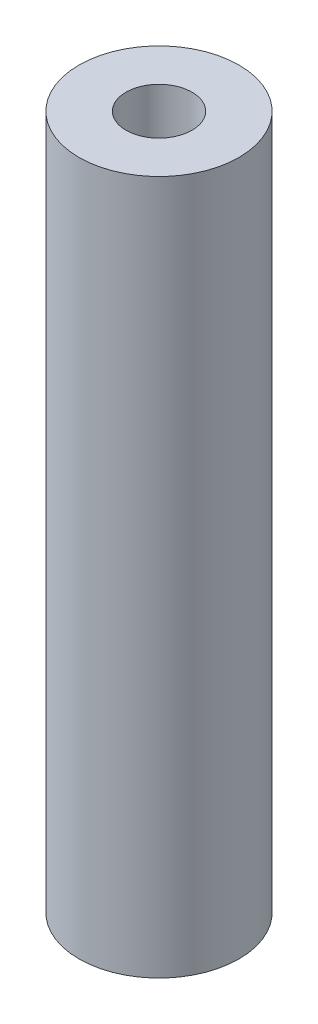
ISO-10303-21;
HEADER;
FILE_DESCRIPTION(('STEP AP214'),'2;1');
FILE_NAME('part.step','',(''),(''),'','','');
FILE_SCHEMA(('AUTOMOTIVE_DESIGN { 1 0 10303 214 1 1 1 1 }'));
ENDSEC;
DATA;
#1=APPLICATION_CONTEXT('core data for automotive mechanical design processes');
#2=APPLICATION_PROTOCOL_DEFINITION('international standard','automotive_design',2000,#1);
#3=PRODUCT_CONTEXT('',#1,'mechanical');
#4=PRODUCT('Part','Part','',(#3));
#5=PRODUCT_RELATED_PRODUCT_CATEGORY('part','',(#4));
#6=PRODUCT_DEFINITION_FORMATION('','',#4);
#7=PRODUCT_DEFINITION_CONTEXT('part definition',#1,'design');
#8=PRODUCT_DEFINITION('design','',#6,#7);
#9=PRODUCT_DEFINITION_SHAPE('','',#8);
#10=(LENGTH_UNIT() NAMED_UNIT(*) SI_UNIT(.MILLI.,.METRE.));
#11=(NAMED_UNIT(*) PLANE_ANGLE_UNIT() SI_UNIT($,.RADIAN.));
#12=(NAMED_UNIT(*) SI_UNIT($,.STERADIAN.) SOLID_ANGLE_UNIT());
#13=UNCERTAINTY_MEASURE_WITH_UNIT(LENGTH_MEASURE(1.E-05),#10,'distance_accuracy_value','');
#14=(GEOMETRIC_REPRESENTATION_CONTEXT(3) GLOBAL_UNCERTAINTY_ASSIGNED_CONTEXT((#13)) GLOBAL_UNIT_ASSIGNED_CONTEXT((#10,
#11,#12)) REPRESENTATION_CONTEXT('',''));
#15=CARTESIAN_POINT('',(0.,0.,0.));
#16=DIRECTION('',(0.,0.,1.));
#17=DIRECTION('',(1.,0.,0.));
#18=AXIS2_PLACEMENT_3D('',#15,#16,#17);
#19=CARTESIAN_POINT('',(0.,34.7,0.));
#20=DIRECTION('',(0.,-1.,0.));
#21=DIRECTION('',(0.,0.,-1.));
#22=AXIS2_PLACEMENT_3D('',#19,#20,#21);
#23=CYLINDRICAL_SURFACE('',#22,4.);
#24=CARTESIAN_POINT('',(0.,34.7,0.));
#25=DIRECTION('',(0.,1.,0.));
#26=DIRECTION('',(0.,0.,1.));
#27=AXIS2_PLACEMENT_3D('',#24,#25,#26);
#28=CIRCLE('',#27,4.);
#29=CARTESIAN_POINT('',(0.,34.7,4.));
#30=VERTEX_POINT('',#29);
#31=EDGE_CURVE('E10',#30,#30,#28,.T.);
#32=ORIENTED_EDGE('',*,*,#31,.F.);
#33=EDGE_LOOP('',(#32));
#34=FACE_BOUND('',#33,.T.);
#35=CARTESIAN_POINT('',(0.,0.,0.));
#36=DIRECTION('',(0.,1.,0.));
#37=DIRECTION('',(0.,0.,1.));
#38=AXIS2_PLACEMENT_3D('',#35,#36,#37);
#39=CIRCLE('',#38,4.);
#40=CARTESIAN_POINT('',(0.,0.,4.));
#41=VERTEX_POINT('',#40);
#42=EDGE_CURVE('E36',#41,#41,#39,.T.);
#43=ORIENTED_EDGE('',*,*,#42,.T.);
#44=EDGE_LOOP('',(#43));
#45=FACE_BOUND('',#44,.T.);
#46=ADVANCED_FACE('F33',(#34,#45),#23,.T.);
#47=CARTESIAN_POINT('',(0.,34.7,0.));
#48=DIRECTION('',(0.,1.,0.));
#49=DIRECTION('',(0.,0.,1.));
#50=AXIS2_PLACEMENT_3D('',#47,#48,#49);
#51=PLANE('',#50);
#52=CARTESIAN_POINT('',(0.,34.7,0.));
#53=DIRECTION('',(0.,1.,0.));
#54=DIRECTION('',(0.,0.,1.));
#55=AXIS2_PLACEMENT_3D('',#52,#53,#54);
#56=CIRCLE('',#55,1.65);
#57=CARTESIAN_POINT('',(0.,34.7,1.65));
#58=VERTEX_POINT('',#57);
#59=EDGE_CURVE('E45',#58,#58,#56,.T.);
#60=ORIENTED_EDGE('',*,*,#59,.F.);
#61=EDGE_LOOP('',(#60));
#62=FACE_BOUND('',#61,.T.);
#63=ORIENTED_EDGE('',*,*,#31,.T.);
#64=EDGE_LOOP('',(#63));
#65=FACE_BOUND('',#64,.T.);
#66=ADVANCED_FACE('F70',(#62,#65),#51,.T.);
#67=CARTESIAN_POINT('',(0.,0.,0.));
#68=DIRECTION('',(0.,1.,0.));
#69=DIRECTION('',(0.,0.,1.));
#70=AXIS2_PLACEMENT_3D('',#67,#68,#69);
#71=PLANE('',#70);
#72=CARTESIAN_POINT('',(0.,0.,0.));
#73=DIRECTION('',(0.,-1.,0.));
#74=DIRECTION('',(0.,0.,-1.));
#75=AXIS2_PLACEMENT_3D('',#72,#73,#74);
#76=CIRCLE('',#75,1.65);
#77=CARTESIAN_POINT('',(0.,0.,-1.65));
#78=VERTEX_POINT('',#77);
#79=EDGE_CURVE('E51',#78,#78,#76,.T.);
#80=ORIENTED_EDGE('',*,*,#79,.F.);
#81=EDGE_LOOP('',(#80));
#82=FACE_BOUND('',#81,.T.);
#83=ORIENTED_EDGE('',*,*,#42,.F.);
#84=EDGE_LOOP('',(#83));
#85=FACE_BOUND('',#84,.T.);
#86=ADVANCED_FACE('F66',(#82,#85),#71,.F.);
#87=CARTESIAN_POINT('',(0.,22.7,0.));
#88=DIRECTION('',(0.,1.,0.));
#89=DIRECTION('',(0.,0.,1.));
#90=AXIS2_PLACEMENT_3D('',#87,#88,#89);
#91=CYLINDRICAL_SURFACE('',#90,1.65);
#92=CARTESIAN_POINT('',(0.,22.7,0.));
#93=DIRECTION('',(0.,1.,0.));
#94=DIRECTION('',(0.,0.,1.));
#95=AXIS2_PLACEMENT_3D('',#92,#93,#94);
#96=CIRCLE('',#95,1.65);
#97=CARTESIAN_POINT('',(0.,22.7,1.65));
#98=VERTEX_POINT('',#97);
#99=EDGE_CURVE('E43',#98,#98,#96,.T.);
#100=ORIENTED_EDGE('',*,*,#99,.F.);
#101=EDGE_LOOP('',(#100));
#102=FACE_BOUND('',#101,.T.);
#103=ORIENTED_EDGE('',*,*,#59,.T.);
#104=EDGE_LOOP('',(#103));
#105=FACE_BOUND('',#104,.T.);
#106=ADVANCED_FACE('F69',(#102,#105),#91,.F.);
#107=CARTESIAN_POINT('',(0.,22.7,0.));
#108=DIRECTION('',(0.,1.,0.));
#109=DIRECTION('',(0.,0.,1.));
#110=AXIS2_PLACEMENT_3D('',#107,#108,#109);
#111=PLANE('',#110);
#112=ORIENTED_EDGE('',*,*,#99,.T.);
#113=EDGE_LOOP('',(#112));
#114=FACE_BOUND('',#113,.T.);
#115=ADVANCED_FACE('F62',(#114),#111,.T.);
#116=CARTESIAN_POINT('',(0.,12.,0.));
#117=DIRECTION('',(0.,-1.,0.));
#118=DIRECTION('',(0.,0.,-1.));
#119=AXIS2_PLACEMENT_3D('',#116,#117,#118);
#120=CYLINDRICAL_SURFACE('',#119,1.65);
#121=CARTESIAN_POINT('',(0.,12.,0.));
#122=DIRECTION('',(0.,-1.,0.));
#123=DIRECTION('',(0.,0.,-1.));
#124=AXIS2_PLACEMENT_3D('',#121,#122,#123);
#125=CIRCLE('',#124,1.65);
#126=CARTESIAN_POINT('',(0.,12.,-1.65));
#127=VERTEX_POINT('',#126);
#128=EDGE_CURVE('E48',#127,#127,#125,.T.);
#129=ORIENTED_EDGE('',*,*,#128,.F.);
#130=EDGE_LOOP('',(#129));
#131=FACE_BOUND('',#130,.T.);
#132=ORIENTED_EDGE('',*,*,#79,.T.);
#133=EDGE_LOOP('',(#132));
#134=FACE_BOUND('',#133,.T.);
#135=ADVANCED_FACE('F59',(#131,#134),#120,.F.);
#136=CARTESIAN_POINT('',(0.,12.,0.));
#137=DIRECTION('',(0.,-1.,0.));
#138=DIRECTION('',(0.,0.,-1.));
#139=AXIS2_PLACEMENT_3D('',#136,#137,#138);
#140=PLANE('',#139);
#141=ORIENTED_EDGE('',*,*,#128,.T.);
#142=EDGE_LOOP('',(#141));
#143=FACE_BOUND('',#142,.T.);
#144=ADVANCED_FACE('F57',(#143),#140,.T.);
#145=CLOSED_SHELL('',(#46,#66,#86,#106,#115,#135,#144));
#146=MANIFOLD_SOLID_BREP('B2',#145);
#147=ADVANCED_BREP_SHAPE_REPRESENTATION('',(#18,#146),#14);
#148=SHAPE_DEFINITION_REPRESENTATION(#9,#147);
ENDSEC;
END-ISO-10303-21;
